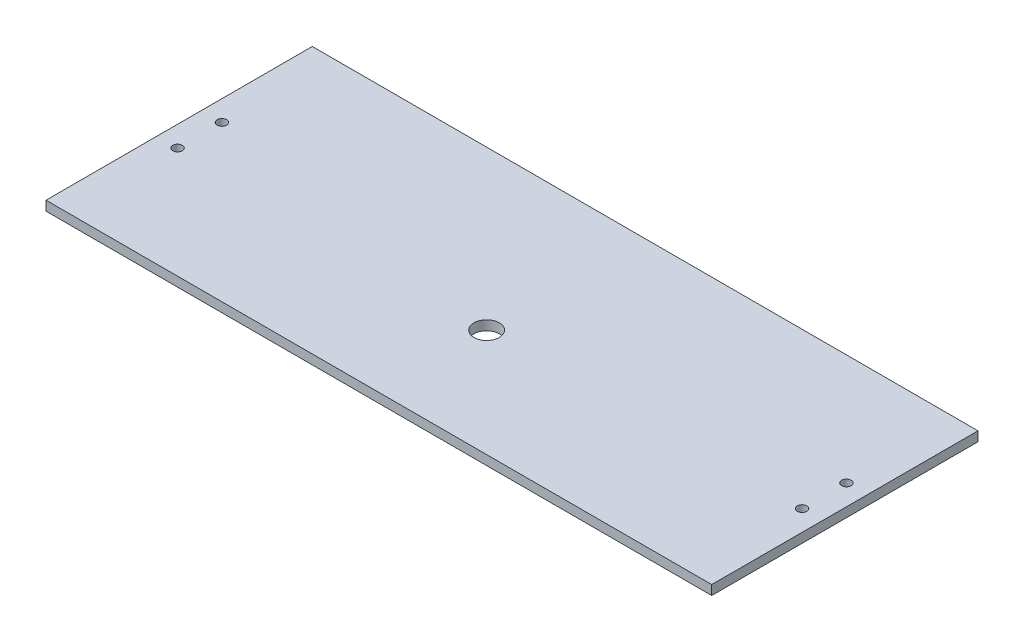
ISO-10303-21;
HEADER;
FILE_DESCRIPTION(('STEP AP214'),'2;1');
FILE_NAME('part.step','',(''),(''),'','','');
FILE_SCHEMA(('AUTOMOTIVE_DESIGN { 1 0 10303 214 1 1 1 1 }'));
ENDSEC;
DATA;
#1=APPLICATION_CONTEXT('core data for automotive mechanical design processes');
#2=APPLICATION_PROTOCOL_DEFINITION('international standard','automotive_design',2000,#1);
#3=PRODUCT_CONTEXT('',#1,'mechanical');
#4=PRODUCT('Part','Part','',(#3));
#5=PRODUCT_RELATED_PRODUCT_CATEGORY('part','',(#4));
#6=PRODUCT_DEFINITION_FORMATION('','',#4);
#7=PRODUCT_DEFINITION_CONTEXT('part definition',#1,'design');
#8=PRODUCT_DEFINITION('design','',#6,#7);
#9=PRODUCT_DEFINITION_SHAPE('','',#8);
#10=(LENGTH_UNIT() NAMED_UNIT(*) SI_UNIT(.MILLI.,.METRE.));
#11=(NAMED_UNIT(*) PLANE_ANGLE_UNIT() SI_UNIT($,.RADIAN.));
#12=(NAMED_UNIT(*) SI_UNIT($,.STERADIAN.) SOLID_ANGLE_UNIT());
#13=UNCERTAINTY_MEASURE_WITH_UNIT(LENGTH_MEASURE(1.E-05),#10,'distance_accuracy_value','');
#14=(GEOMETRIC_REPRESENTATION_CONTEXT(3) GLOBAL_UNCERTAINTY_ASSIGNED_CONTEXT((#13)) GLOBAL_UNIT_ASSIGNED_CONTEXT((#10,
#11,#12)) REPRESENTATION_CONTEXT('',''));
#15=CARTESIAN_POINT('',(0.,0.,0.));
#16=DIRECTION('',(0.,0.,1.));
#17=DIRECTION('',(1.,0.,0.));
#18=AXIS2_PLACEMENT_3D('',#15,#16,#17);
#19=CARTESIAN_POINT('',(119.498385096091,706.628389677579,-82.4394674818287));
#20=DIRECTION('',(1.,0.,0.));
#21=DIRECTION('',(0.,0.,-1.));
#22=AXIS2_PLACEMENT_3D('',#19,#20,#21);
#23=PLANE('',#22);
#24=DIRECTION('',(0.,0.,1.));
#25=VECTOR('',#24,1.);
#26=CARTESIAN_POINT('',(119.498385096091,703.628389677579,-82.4394674818287));
#27=LINE('',#26,#25);
#28=CARTESIAN_POINT('',(119.498385096091,703.628389677579,-82.4394674818287));
#29=VERTEX_POINT('',#28);
#30=CARTESIAN_POINT('',(119.498385096091,703.628389677579,1.56053251817128));
#31=VERTEX_POINT('',#30);
#32=EDGE_CURVE('E98',#29,#31,#27,.T.);
#33=ORIENTED_EDGE('',*,*,#32,.F.);
#34=DIRECTION('',(0.,-1.,0.));
#35=VECTOR('',#34,1.);
#36=CARTESIAN_POINT('',(119.498385096091,706.628389677579,-82.4394674818287));
#37=LINE('',#36,#35);
#38=CARTESIAN_POINT('',(119.498385096091,706.628389677579,-82.4394674818287));
#39=VERTEX_POINT('',#38);
#40=EDGE_CURVE('E11',#39,#29,#37,.T.);
#41=ORIENTED_EDGE('',*,*,#40,.F.);
#42=DIRECTION('',(0.,0.,1.));
#43=VECTOR('',#42,1.);
#44=CARTESIAN_POINT('',(119.498385096091,706.628389677579,-82.4394674818287));
#45=LINE('',#44,#43);
#46=CARTESIAN_POINT('',(119.498385096091,706.628389677579,1.56053251817128));
#47=VERTEX_POINT('',#46);
#48=EDGE_CURVE('E91',#39,#47,#45,.T.);
#49=ORIENTED_EDGE('',*,*,#48,.T.);
#50=DIRECTION('',(0.,-1.,0.));
#51=VECTOR('',#50,1.);
#52=CARTESIAN_POINT('',(119.498385096091,706.628389677579,1.56053251817128));
#53=LINE('',#52,#51);
#54=EDGE_CURVE('E36',#47,#31,#53,.T.);
#55=ORIENTED_EDGE('',*,*,#54,.T.);
#56=EDGE_LOOP('',(#33,#41,#49,#55));
#57=FACE_BOUND('',#56,.T.);
#58=ADVANCED_FACE('F33',(#57),#23,.T.);
#59=CARTESIAN_POINT('',(119.498385096091,706.628389677579,-82.4394674818287));
#60=DIRECTION('',(0.,0.,-1.));
#61=DIRECTION('',(0.,1.,0.));
#62=AXIS2_PLACEMENT_3D('',#59,#60,#61);
#63=PLANE('',#62);
#64=DIRECTION('',(1.,0.,0.));
#65=VECTOR('',#64,1.);
#66=CARTESIAN_POINT('',(119.498385096091,703.628389677579,-82.4394674818287));
#67=LINE('',#66,#65);
#68=CARTESIAN_POINT('',(-90.5016149039087,703.628389677579,-82.4394674818287));
#69=VERTEX_POINT('',#68);
#70=EDGE_CURVE('E93',#69,#29,#67,.T.);
#71=ORIENTED_EDGE('',*,*,#70,.F.);
#72=DIRECTION('',(0.,-1.,0.));
#73=VECTOR('',#72,1.);
#74=CARTESIAN_POINT('',(-90.5016149039087,706.628389677579,-82.4394674818287));
#75=LINE('',#74,#73);
#76=CARTESIAN_POINT('',(-90.5016149039087,706.628389677579,-82.4394674818287));
#77=VERTEX_POINT('',#76);
#78=EDGE_CURVE('E42',#77,#69,#75,.T.);
#79=ORIENTED_EDGE('',*,*,#78,.F.);
#80=DIRECTION('',(1.,0.,0.));
#81=VECTOR('',#80,1.);
#82=CARTESIAN_POINT('',(119.498385096091,706.628389677579,-82.4394674818287));
#83=LINE('',#82,#81);
#84=EDGE_CURVE('E88',#77,#39,#83,.T.);
#85=ORIENTED_EDGE('',*,*,#84,.T.);
#86=ORIENTED_EDGE('',*,*,#40,.T.);
#87=EDGE_LOOP('',(#71,#79,#85,#86));
#88=FACE_BOUND('',#87,.T.);
#89=ADVANCED_FACE('F109',(#88),#63,.T.);
#90=CARTESIAN_POINT('',(-90.5016149039087,706.628389677579,-82.4394674818287));
#91=DIRECTION('',(-1.,0.,0.));
#92=DIRECTION('',(0.,0.,1.));
#93=AXIS2_PLACEMENT_3D('',#90,#91,#92);
#94=PLANE('',#93);
#95=DIRECTION('',(0.,0.,-1.));
#96=VECTOR('',#95,1.);
#97=CARTESIAN_POINT('',(-90.5016149039087,703.628389677579,-82.4394674818287));
#98=LINE('',#97,#96);
#99=CARTESIAN_POINT('',(-90.5016149039087,703.628389677579,1.56053251817128));
#100=VERTEX_POINT('',#99);
#101=EDGE_CURVE('E83',#100,#69,#98,.T.);
#102=ORIENTED_EDGE('',*,*,#101,.F.);
#103=DIRECTION('',(0.,-1.,0.));
#104=VECTOR('',#103,1.);
#105=CARTESIAN_POINT('',(-90.5016149039087,706.628389677579,1.56053251817128));
#106=LINE('',#105,#104);
#107=CARTESIAN_POINT('',(-90.5016149039087,706.628389677579,1.56053251817128));
#108=VERTEX_POINT('',#107);
#109=EDGE_CURVE('E78',#108,#100,#106,.T.);
#110=ORIENTED_EDGE('',*,*,#109,.F.);
#111=DIRECTION('',(0.,0.,-1.));
#112=VECTOR('',#111,1.);
#113=CARTESIAN_POINT('',(-90.5016149039087,706.628389677579,-82.4394674818287));
#114=LINE('',#113,#112);
#115=EDGE_CURVE('E81',#108,#77,#114,.T.);
#116=ORIENTED_EDGE('',*,*,#115,.T.);
#117=ORIENTED_EDGE('',*,*,#78,.T.);
#118=EDGE_LOOP('',(#102,#110,#116,#117));
#119=FACE_BOUND('',#118,.T.);
#120=ADVANCED_FACE('F80',(#119),#94,.T.);
#121=CARTESIAN_POINT('',(119.498385096091,706.628389677579,1.56053251817128));
#122=DIRECTION('',(0.,0.,1.));
#123=DIRECTION('',(0.,-1.,0.));
#124=AXIS2_PLACEMENT_3D('',#121,#122,#123);
#125=PLANE('',#124);
#126=DIRECTION('',(-1.,0.,0.));
#127=VECTOR('',#126,1.);
#128=CARTESIAN_POINT('',(119.498385096091,703.628389677579,1.56053251817128));
#129=LINE('',#128,#127);
#130=EDGE_CURVE('E101',#31,#100,#129,.T.);
#131=ORIENTED_EDGE('',*,*,#130,.F.);
#132=ORIENTED_EDGE('',*,*,#54,.F.);
#133=DIRECTION('',(-1.,0.,0.));
#134=VECTOR('',#133,1.);
#135=CARTESIAN_POINT('',(119.498385096091,706.628389677579,1.56053251817128));
#136=LINE('',#135,#134);
#137=EDGE_CURVE('E87',#47,#108,#136,.T.);
#138=ORIENTED_EDGE('',*,*,#137,.T.);
#139=ORIENTED_EDGE('',*,*,#109,.T.);
#140=EDGE_LOOP('',(#131,#132,#138,#139));
#141=FACE_BOUND('',#140,.T.);
#142=ADVANCED_FACE('F90',(#141),#125,.T.);
#143=CARTESIAN_POINT('',(0.,706.628389677579,0.));
#144=DIRECTION('',(0.,-1.,0.));
#145=DIRECTION('',(0.,0.,-1.));
#146=AXIS2_PLACEMENT_3D('',#143,#144,#145);
#147=PLANE('',#146);
#148=CARTESIAN_POINT('',(-84.0016149039087,706.628389677579,-33.4394674818287));
#149=DIRECTION('',(0.,-1.,0.));
#150=DIRECTION('',(0.,0.,-1.));
#151=AXIS2_PLACEMENT_3D('',#148,#149,#150);
#152=CIRCLE('',#151,1.50000000000001);
#153=CARTESIAN_POINT('',(-84.0016149039087,706.628389677579,-34.9394674818287));
#154=VERTEX_POINT('',#153);
#155=EDGE_CURVE('E154',#154,#154,#152,.T.);
#156=ORIENTED_EDGE('',*,*,#155,.T.);
#157=EDGE_LOOP('',(#156));
#158=FACE_BOUND('',#157,.T.);
#159=CARTESIAN_POINT('',(-84.0016149039087,706.628389677579,-47.4394674818287));
#160=DIRECTION('',(0.,-1.,0.));
#161=DIRECTION('',(0.,0.,-1.));
#162=AXIS2_PLACEMENT_3D('',#159,#160,#161);
#163=CIRCLE('',#162,1.5);
#164=CARTESIAN_POINT('',(-84.0016149039087,706.628389677579,-48.9394674818287));
#165=VERTEX_POINT('',#164);
#166=EDGE_CURVE('E162',#165,#165,#163,.T.);
#167=ORIENTED_EDGE('',*,*,#166,.T.);
#168=EDGE_LOOP('',(#167));
#169=FACE_BOUND('',#168,.T.);
#170=CARTESIAN_POINT('',(112.998385096091,706.628389677579,-47.4394674818287));
#171=DIRECTION('',(0.,-1.,0.));
#172=DIRECTION('',(0.,0.,-1.));
#173=AXIS2_PLACEMENT_3D('',#170,#171,#172);
#174=CIRCLE('',#173,1.5);
#175=CARTESIAN_POINT('',(112.998385096091,706.628389677579,-48.9394674818287));
#176=VERTEX_POINT('',#175);
#177=EDGE_CURVE('E168',#176,#176,#174,.T.);
#178=ORIENTED_EDGE('',*,*,#177,.T.);
#179=EDGE_LOOP('',(#178));
#180=FACE_BOUND('',#179,.T.);
#181=CARTESIAN_POINT('',(112.998385096091,706.628389677579,-33.4394674818287));
#182=DIRECTION('',(0.,-1.,0.));
#183=DIRECTION('',(0.,0.,-1.));
#184=AXIS2_PLACEMENT_3D('',#181,#182,#183);
#185=CIRCLE('',#184,1.5);
#186=CARTESIAN_POINT('',(112.998385096091,706.628389677579,-34.9394674818287));
#187=VERTEX_POINT('',#186);
#188=EDGE_CURVE('E174',#187,#187,#185,.T.);
#189=ORIENTED_EDGE('',*,*,#188,.T.);
#190=EDGE_LOOP('',(#189));
#191=FACE_BOUND('',#190,.T.);
#192=CARTESIAN_POINT('',(14.4983850960913,706.628389677579,-32.4394674818287));
#193=DIRECTION('',(0.,-1.,0.));
#194=DIRECTION('',(0.,0.,-1.));
#195=AXIS2_PLACEMENT_3D('',#192,#193,#194);
#196=CIRCLE('',#195,4.00000000000001);
#197=CARTESIAN_POINT('',(14.4983850960913,706.628389677579,-36.4394674818287));
#198=VERTEX_POINT('',#197);
#199=EDGE_CURVE('E102',#198,#198,#196,.T.);
#200=ORIENTED_EDGE('',*,*,#199,.T.);
#201=EDGE_LOOP('',(#200));
#202=FACE_BOUND('',#201,.T.);
#203=ORIENTED_EDGE('',*,*,#48,.F.);
#204=ORIENTED_EDGE('',*,*,#84,.F.);
#205=ORIENTED_EDGE('',*,*,#115,.F.);
#206=ORIENTED_EDGE('',*,*,#137,.F.);
#207=EDGE_LOOP('',(#203,#204,#205,#206));
#208=FACE_BOUND('',#207,.T.);
#209=ADVANCED_FACE('F86',(#158,#169,#180,#191,#202,#208),#147,.F.);
#210=CARTESIAN_POINT('',(0.,703.628389677579,0.));
#211=DIRECTION('',(0.,-1.,0.));
#212=DIRECTION('',(0.,0.,-1.));
#213=AXIS2_PLACEMENT_3D('',#210,#211,#212);
#214=PLANE('',#213);
#215=CARTESIAN_POINT('',(-84.0016149039087,703.628389677579,-33.4394674818287));
#216=DIRECTION('',(0.,-1.,0.));
#217=DIRECTION('',(0.,0.,-1.));
#218=AXIS2_PLACEMENT_3D('',#215,#216,#217);
#219=CIRCLE('',#218,1.50000000000001);
#220=CARTESIAN_POINT('',(-84.0016149039087,703.628389677579,-34.9394674818287));
#221=VERTEX_POINT('',#220);
#222=EDGE_CURVE('E157',#221,#221,#219,.T.);
#223=ORIENTED_EDGE('',*,*,#222,.F.);
#224=EDGE_LOOP('',(#223));
#225=FACE_BOUND('',#224,.T.);
#226=CARTESIAN_POINT('',(-84.0016149039087,703.628389677579,-47.4394674818287));
#227=DIRECTION('',(0.,-1.,0.));
#228=DIRECTION('',(0.,0.,-1.));
#229=AXIS2_PLACEMENT_3D('',#226,#227,#228);
#230=CIRCLE('',#229,1.5);
#231=CARTESIAN_POINT('',(-84.0016149039087,703.628389677579,-48.9394674818287));
#232=VERTEX_POINT('',#231);
#233=EDGE_CURVE('E159',#232,#232,#230,.T.);
#234=ORIENTED_EDGE('',*,*,#233,.F.);
#235=EDGE_LOOP('',(#234));
#236=FACE_BOUND('',#235,.T.);
#237=CARTESIAN_POINT('',(112.998385096091,703.628389677579,-47.4394674818287));
#238=DIRECTION('',(0.,-1.,0.));
#239=DIRECTION('',(0.,0.,-1.));
#240=AXIS2_PLACEMENT_3D('',#237,#238,#239);
#241=CIRCLE('',#240,1.5);
#242=CARTESIAN_POINT('',(112.998385096091,703.628389677579,-48.9394674818287));
#243=VERTEX_POINT('',#242);
#244=EDGE_CURVE('E165',#243,#243,#241,.T.);
#245=ORIENTED_EDGE('',*,*,#244,.F.);
#246=EDGE_LOOP('',(#245));
#247=FACE_BOUND('',#246,.T.);
#248=CARTESIAN_POINT('',(112.998385096091,703.628389677579,-33.4394674818287));
#249=DIRECTION('',(0.,-1.,0.));
#250=DIRECTION('',(0.,0.,-1.));
#251=AXIS2_PLACEMENT_3D('',#248,#249,#250);
#252=CIRCLE('',#251,1.5);
#253=CARTESIAN_POINT('',(112.998385096091,703.628389677579,-34.9394674818287));
#254=VERTEX_POINT('',#253);
#255=EDGE_CURVE('E171',#254,#254,#252,.T.);
#256=ORIENTED_EDGE('',*,*,#255,.F.);
#257=EDGE_LOOP('',(#256));
#258=FACE_BOUND('',#257,.T.);
#259=CARTESIAN_POINT('',(14.4983850960913,703.628389677579,-32.4394674818287));
#260=DIRECTION('',(0.,-1.,0.));
#261=DIRECTION('',(0.,0.,-1.));
#262=AXIS2_PLACEMENT_3D('',#259,#260,#261);
#263=CIRCLE('',#262,4.00000000000001);
#264=CARTESIAN_POINT('',(14.4983850960913,703.628389677579,-36.4394674818287));
#265=VERTEX_POINT('',#264);
#266=EDGE_CURVE('E177',#265,#265,#263,.T.);
#267=ORIENTED_EDGE('',*,*,#266,.F.);
#268=EDGE_LOOP('',(#267));
#269=FACE_BOUND('',#268,.T.);
#270=ORIENTED_EDGE('',*,*,#32,.T.);
#271=ORIENTED_EDGE('',*,*,#130,.T.);
#272=ORIENTED_EDGE('',*,*,#101,.T.);
#273=ORIENTED_EDGE('',*,*,#70,.T.);
#274=EDGE_LOOP('',(#270,#271,#272,#273));
#275=FACE_BOUND('',#274,.T.);
#276=ADVANCED_FACE('F108',(#225,#236,#247,#258,#269,#275),#214,.T.);
#277=CARTESIAN_POINT('',(14.4983850960913,706.628389677579,-32.4394674818287));
#278=DIRECTION('',(0.,-1.,0.));
#279=DIRECTION('',(0.,0.,-1.));
#280=AXIS2_PLACEMENT_3D('',#277,#278,#279);
#281=CYLINDRICAL_SURFACE('',#280,4.00000000000001);
#282=ORIENTED_EDGE('',*,*,#199,.F.);
#283=EDGE_LOOP('',(#282));
#284=FACE_BOUND('',#283,.T.);
#285=ORIENTED_EDGE('',*,*,#266,.T.);
#286=EDGE_LOOP('',(#285));
#287=FACE_BOUND('',#286,.T.);
#288=ADVANCED_FACE('F127',(#284,#287),#281,.F.);
#289=CARTESIAN_POINT('',(112.998385096091,706.628389677579,-33.4394674818287));
#290=DIRECTION('',(0.,-1.,0.));
#291=DIRECTION('',(0.,0.,-1.));
#292=AXIS2_PLACEMENT_3D('',#289,#290,#291);
#293=CYLINDRICAL_SURFACE('',#292,1.5);
#294=ORIENTED_EDGE('',*,*,#188,.F.);
#295=EDGE_LOOP('',(#294));
#296=FACE_BOUND('',#295,.T.);
#297=ORIENTED_EDGE('',*,*,#255,.T.);
#298=EDGE_LOOP('',(#297));
#299=FACE_BOUND('',#298,.T.);
#300=ADVANCED_FACE('F134',(#296,#299),#293,.F.);
#301=CARTESIAN_POINT('',(112.998385096091,706.628389677579,-47.4394674818287));
#302=DIRECTION('',(0.,-1.,0.));
#303=DIRECTION('',(0.,0.,-1.));
#304=AXIS2_PLACEMENT_3D('',#301,#302,#303);
#305=CYLINDRICAL_SURFACE('',#304,1.5);
#306=ORIENTED_EDGE('',*,*,#177,.F.);
#307=EDGE_LOOP('',(#306));
#308=FACE_BOUND('',#307,.T.);
#309=ORIENTED_EDGE('',*,*,#244,.T.);
#310=EDGE_LOOP('',(#309));
#311=FACE_BOUND('',#310,.T.);
#312=ADVANCED_FACE('F138',(#308,#311),#305,.F.);
#313=CARTESIAN_POINT('',(-84.0016149039087,706.628389677579,-47.4394674818287));
#314=DIRECTION('',(0.,-1.,0.));
#315=DIRECTION('',(0.,0.,-1.));
#316=AXIS2_PLACEMENT_3D('',#313,#314,#315);
#317=CYLINDRICAL_SURFACE('',#316,1.5);
#318=ORIENTED_EDGE('',*,*,#166,.F.);
#319=EDGE_LOOP('',(#318));
#320=FACE_BOUND('',#319,.T.);
#321=ORIENTED_EDGE('',*,*,#233,.T.);
#322=EDGE_LOOP('',(#321));
#323=FACE_BOUND('',#322,.T.);
#324=ADVANCED_FACE('F142',(#320,#323),#317,.F.);
#325=CARTESIAN_POINT('',(-84.0016149039087,706.628389677579,-33.4394674818287));
#326=DIRECTION('',(0.,-1.,0.));
#327=DIRECTION('',(0.,0.,-1.));
#328=AXIS2_PLACEMENT_3D('',#325,#326,#327);
#329=CYLINDRICAL_SURFACE('',#328,1.50000000000001);
#330=ORIENTED_EDGE('',*,*,#155,.F.);
#331=EDGE_LOOP('',(#330));
#332=FACE_BOUND('',#331,.T.);
#333=ORIENTED_EDGE('',*,*,#222,.T.);
#334=EDGE_LOOP('',(#333));
#335=FACE_BOUND('',#334,.T.);
#336=ADVANCED_FACE('F146',(#332,#335),#329,.F.);
#337=CLOSED_SHELL('',(#58,#89,#120,#142,#209,#276,#288,#300,#312,#324,#336));
#338=MANIFOLD_SOLID_BREP('B2',#337);
#339=ADVANCED_BREP_SHAPE_REPRESENTATION('',(#18,#338),#14);
#340=SHAPE_DEFINITION_REPRESENTATION(#9,#339);
ENDSEC;
END-ISO-10303-21;
